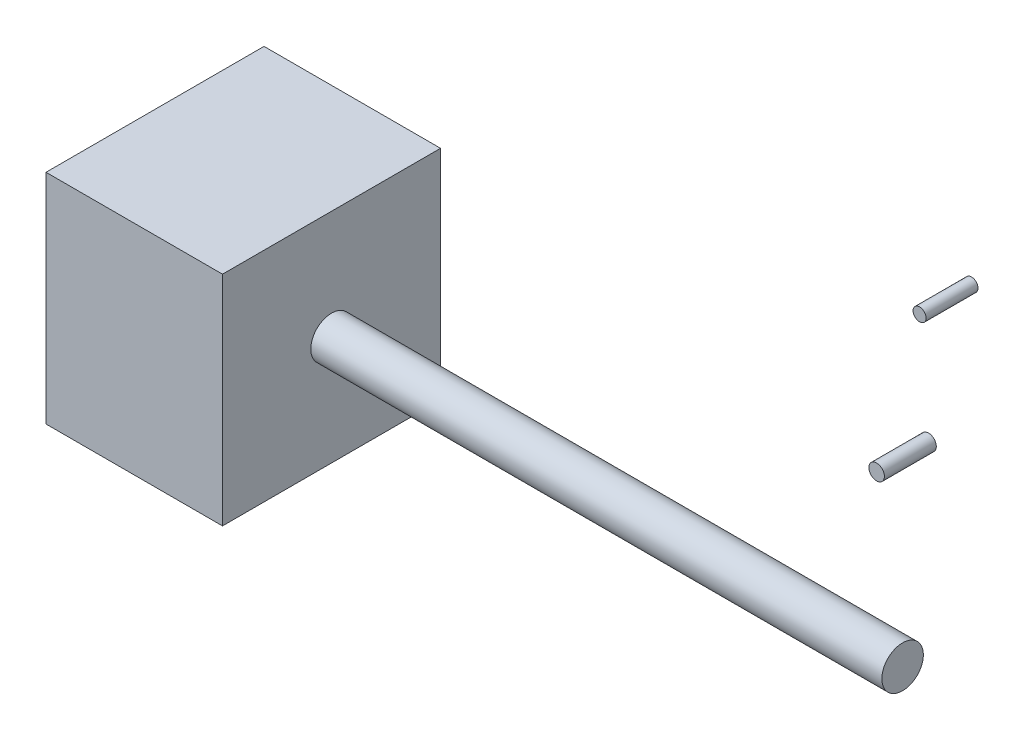
ISO-10303-21;
HEADER;
FILE_DESCRIPTION(('STEP AP214'),'2;1');
FILE_NAME('part.step','',(''),(''),'','','');
FILE_SCHEMA(('AUTOMOTIVE_DESIGN { 1 0 10303 214 1 1 1 1 }'));
ENDSEC;
DATA;
#1=APPLICATION_CONTEXT('core data for automotive mechanical design processes');
#2=APPLICATION_PROTOCOL_DEFINITION('international standard','automotive_design',2000,#1);
#3=PRODUCT_CONTEXT('',#1,'mechanical');
#4=PRODUCT('Part','Part','',(#3));
#5=PRODUCT_RELATED_PRODUCT_CATEGORY('part','',(#4));
#6=PRODUCT_DEFINITION_FORMATION('','',#4);
#7=PRODUCT_DEFINITION_CONTEXT('part definition',#1,'design');
#8=PRODUCT_DEFINITION('design','',#6,#7);
#9=PRODUCT_DEFINITION_SHAPE('','',#8);
#10=(LENGTH_UNIT() NAMED_UNIT(*) SI_UNIT(.MILLI.,.METRE.));
#11=(NAMED_UNIT(*) PLANE_ANGLE_UNIT() SI_UNIT($,.RADIAN.));
#12=(NAMED_UNIT(*) SI_UNIT($,.STERADIAN.) SOLID_ANGLE_UNIT());
#13=UNCERTAINTY_MEASURE_WITH_UNIT(LENGTH_MEASURE(1.E-05),#10,'distance_accuracy_value','');
#14=(GEOMETRIC_REPRESENTATION_CONTEXT(3) GLOBAL_UNCERTAINTY_ASSIGNED_CONTEXT((#13)) GLOBAL_UNIT_ASSIGNED_CONTEXT((#10,
#11,#12)) REPRESENTATION_CONTEXT('',''));
#15=CARTESIAN_POINT('',(0.,0.,0.));
#16=DIRECTION('',(0.,0.,1.));
#17=DIRECTION('',(1.,0.,0.));
#18=AXIS2_PLACEMENT_3D('',#15,#16,#17);
#19=CARTESIAN_POINT('',(108.277164679753,65.4293406084366,5.));
#20=DIRECTION('',(0.,0.,-1.));
#21=DIRECTION('',(-1.,0.,0.));
#22=AXIS2_PLACEMENT_3D('',#19,#20,#21);
#23=CYLINDRICAL_SURFACE('',#22,1.25);
#24=CARTESIAN_POINT('',(108.277164679753,65.4293406084366,5.));
#25=DIRECTION('',(0.,0.,1.));
#26=DIRECTION('',(1.,0.,0.));
#27=AXIS2_PLACEMENT_3D('',#24,#25,#26);
#28=CIRCLE('',#27,1.25);
#29=CARTESIAN_POINT('',(109.527164679753,65.4293406084366,5.));
#30=VERTEX_POINT('',#29);
#31=EDGE_CURVE('E11',#30,#30,#28,.T.);
#32=ORIENTED_EDGE('',*,*,#31,.F.);
#33=EDGE_LOOP('',(#32));
#34=FACE_BOUND('',#33,.T.);
#35=CARTESIAN_POINT('',(108.277164679753,65.4293406084366,-5.));
#36=DIRECTION('',(0.,0.,1.));
#37=DIRECTION('',(1.,0.,0.));
#38=AXIS2_PLACEMENT_3D('',#35,#36,#37);
#39=CIRCLE('',#38,1.25);
#40=CARTESIAN_POINT('',(109.527164679753,65.4293406084366,-5.));
#41=VERTEX_POINT('',#40);
#42=EDGE_CURVE('E44',#41,#41,#39,.T.);
#43=ORIENTED_EDGE('',*,*,#42,.T.);
#44=EDGE_LOOP('',(#43));
#45=FACE_BOUND('',#44,.T.);
#46=ADVANCED_FACE('F41',(#34,#45),#23,.T.);
#47=CARTESIAN_POINT('',(108.277164679753,65.4293406084366,5.));
#48=DIRECTION('',(0.,0.,1.));
#49=DIRECTION('',(1.,0.,0.));
#50=AXIS2_PLACEMENT_3D('',#47,#48,#49);
#51=PLANE('',#50);
#52=ORIENTED_EDGE('',*,*,#31,.T.);
#53=EDGE_LOOP('',(#52));
#54=FACE_BOUND('',#53,.T.);
#55=ADVANCED_FACE('F56',(#54),#51,.T.);
#56=CARTESIAN_POINT('',(108.277164679753,65.4293406084366,-5.));
#57=DIRECTION('',(0.,0.,1.));
#58=DIRECTION('',(1.,0.,0.));
#59=AXIS2_PLACEMENT_3D('',#56,#57,#58);
#60=PLANE('',#59);
#61=ORIENTED_EDGE('',*,*,#42,.F.);
#62=EDGE_LOOP('',(#61));
#63=FACE_BOUND('',#62,.T.);
#64=ADVANCED_FACE('F54',(#63),#60,.F.);
#65=CLOSED_SHELL('',(#46,#55,#64));
#66=MANIFOLD_SOLID_BREP('B2_NOT_SHOWN',#65);
#67=CARTESIAN_POINT('',(100.,35.,5.));
#68=DIRECTION('',(0.,0.,-1.));
#69=DIRECTION('',(-1.,0.,0.));
#70=AXIS2_PLACEMENT_3D('',#67,#68,#69);
#71=CYLINDRICAL_SURFACE('',#70,1.5);
#72=CARTESIAN_POINT('',(100.,35.,5.));
#73=DIRECTION('',(0.,0.,1.));
#74=DIRECTION('',(1.,0.,0.));
#75=AXIS2_PLACEMENT_3D('',#72,#73,#74);
#76=CIRCLE('',#75,1.5);
#77=CARTESIAN_POINT('',(101.5,35.,5.));
#78=VERTEX_POINT('',#77);
#79=EDGE_CURVE('E40',#78,#78,#76,.T.);
#80=ORIENTED_EDGE('',*,*,#79,.F.);
#81=EDGE_LOOP('',(#80));
#82=FACE_BOUND('',#81,.T.);
#83=CARTESIAN_POINT('',(100.,35.,-5.));
#84=DIRECTION('',(0.,0.,1.));
#85=DIRECTION('',(1.,0.,0.));
#86=AXIS2_PLACEMENT_3D('',#83,#84,#85);
#87=CIRCLE('',#86,1.5);
#88=CARTESIAN_POINT('',(101.5,35.,-5.));
#89=VERTEX_POINT('',#88);
#90=EDGE_CURVE('E93',#89,#89,#87,.T.);
#91=ORIENTED_EDGE('',*,*,#90,.T.);
#92=EDGE_LOOP('',(#91));
#93=FACE_BOUND('',#92,.T.);
#94=ADVANCED_FACE('F90',(#82,#93),#71,.T.);
#95=CARTESIAN_POINT('',(100.,35.,5.));
#96=DIRECTION('',(0.,0.,1.));
#97=DIRECTION('',(1.,0.,0.));
#98=AXIS2_PLACEMENT_3D('',#95,#96,#97);
#99=PLANE('',#98);
#100=ORIENTED_EDGE('',*,*,#79,.T.);
#101=EDGE_LOOP('',(#100));
#102=FACE_BOUND('',#101,.T.);
#103=ADVANCED_FACE('F105',(#102),#99,.T.);
#104=CARTESIAN_POINT('',(100.,35.,-5.));
#105=DIRECTION('',(0.,0.,1.));
#106=DIRECTION('',(1.,0.,0.));
#107=AXIS2_PLACEMENT_3D('',#104,#105,#106);
#108=PLANE('',#107);
#109=ORIENTED_EDGE('',*,*,#90,.F.);
#110=EDGE_LOOP('',(#109));
#111=FACE_BOUND('',#110,.T.);
#112=ADVANCED_FACE('F103',(#111),#108,.F.);
#113=CLOSED_SHELL('',(#94,#103,#112));
#114=MANIFOLD_SOLID_BREP('B6_NOT_SHOWN',#113);
#115=CARTESIAN_POINT('',(100.,0.,0.));
#116=DIRECTION('',(-1.,0.,0.));
#117=DIRECTION('',(0.,0.,1.));
#118=AXIS2_PLACEMENT_3D('',#115,#116,#117);
#119=CYLINDRICAL_SURFACE('',#118,4.);
#120=CARTESIAN_POINT('',(100.,0.,0.));
#121=DIRECTION('',(1.,0.,0.));
#122=DIRECTION('',(0.,0.,-1.));
#123=AXIS2_PLACEMENT_3D('',#120,#121,#122);
#124=CIRCLE('',#123,4.);
#125=CARTESIAN_POINT('',(100.,0.,-4.));
#126=VERTEX_POINT('',#125);
#127=EDGE_CURVE('E138',#126,#126,#124,.T.);
#128=ORIENTED_EDGE('',*,*,#127,.F.);
#129=EDGE_LOOP('',(#128));
#130=FACE_BOUND('',#129,.T.);
#131=CARTESIAN_POINT('',(-9.99999999999999,0.,0.));
#132=DIRECTION('',(-1.,0.,0.));
#133=DIRECTION('',(0.,0.,1.));
#134=AXIS2_PLACEMENT_3D('',#131,#132,#133);
#135=CIRCLE('',#134,4.);
#136=CARTESIAN_POINT('',(-9.99999999999999,0.,4.));
#137=VERTEX_POINT('',#136);
#138=EDGE_CURVE('E88',#137,#137,#135,.T.);
#139=ORIENTED_EDGE('',*,*,#138,.F.);
#140=EDGE_LOOP('',(#139));
#141=FACE_BOUND('',#140,.T.);
#142=ADVANCED_FACE('F130',(#130,#141),#119,.T.);
#143=CARTESIAN_POINT('',(100.,0.,0.));
#144=DIRECTION('',(1.,0.,0.));
#145=DIRECTION('',(0.,0.,-1.));
#146=AXIS2_PLACEMENT_3D('',#143,#144,#145);
#147=PLANE('',#146);
#148=ORIENTED_EDGE('',*,*,#127,.T.);
#149=EDGE_LOOP('',(#148));
#150=FACE_BOUND('',#149,.T.);
#151=ADVANCED_FACE('F206',(#150),#147,.T.);
#152=CARTESIAN_POINT('',(-44.,-21.,-21.));
#153=DIRECTION('',(0.,0.,-1.));
#154=DIRECTION('',(-1.,0.,0.));
#155=AXIS2_PLACEMENT_3D('',#152,#153,#154);
#156=PLANE('',#155);
#157=DIRECTION('',(0.,1.,0.));
#158=VECTOR('',#157,1.);
#159=CARTESIAN_POINT('',(-10.,-21.,-21.));
#160=LINE('',#159,#158);
#161=CARTESIAN_POINT('',(-10.,-21.,-21.));
#162=VERTEX_POINT('',#161);
#163=CARTESIAN_POINT('',(-10.,21.,-21.));
#164=VERTEX_POINT('',#163);
#165=EDGE_CURVE('E163',#162,#164,#160,.T.);
#166=ORIENTED_EDGE('',*,*,#165,.F.);
#167=DIRECTION('',(1.,0.,0.));
#168=VECTOR('',#167,1.);
#169=CARTESIAN_POINT('',(-44.,-21.,-21.));
#170=LINE('',#169,#168);
#171=CARTESIAN_POINT('',(-44.,-21.,-21.));
#172=VERTEX_POINT('',#171);
#173=EDGE_CURVE('E193',#172,#162,#170,.T.);
#174=ORIENTED_EDGE('',*,*,#173,.F.);
#175=DIRECTION('',(0.,1.,0.));
#176=VECTOR('',#175,1.);
#177=CARTESIAN_POINT('',(-44.,-21.,-21.));
#178=LINE('',#177,#176);
#179=CARTESIAN_POINT('',(-44.,21.,-21.));
#180=VERTEX_POINT('',#179);
#181=EDGE_CURVE('E200',#172,#180,#178,.T.);
#182=ORIENTED_EDGE('',*,*,#181,.T.);
#183=DIRECTION('',(1.,0.,0.));
#184=VECTOR('',#183,1.);
#185=CARTESIAN_POINT('',(-44.,21.,-21.));
#186=LINE('',#185,#184);
#187=EDGE_CURVE('E190',#180,#164,#186,.T.);
#188=ORIENTED_EDGE('',*,*,#187,.T.);
#189=EDGE_LOOP('',(#166,#174,#182,#188));
#190=FACE_BOUND('',#189,.T.);
#191=ADVANCED_FACE('F222',(#190),#156,.T.);
#192=CARTESIAN_POINT('',(-44.,-21.,21.));
#193=DIRECTION('',(0.,-1.,0.));
#194=DIRECTION('',(0.,0.,-1.));
#195=AXIS2_PLACEMENT_3D('',#192,#193,#194);
#196=PLANE('',#195);
#197=DIRECTION('',(0.,0.,-1.));
#198=VECTOR('',#197,1.);
#199=CARTESIAN_POINT('',(-10.,-21.,21.));
#200=LINE('',#199,#198);
#201=CARTESIAN_POINT('',(-10.,-21.,21.));
#202=VERTEX_POINT('',#201);
#203=EDGE_CURVE('E146',#202,#162,#200,.T.);
#204=ORIENTED_EDGE('',*,*,#203,.F.);
#205=DIRECTION('',(1.,0.,0.));
#206=VECTOR('',#205,1.);
#207=CARTESIAN_POINT('',(-44.,-21.,21.));
#208=LINE('',#207,#206);
#209=CARTESIAN_POINT('',(-44.,-21.,21.));
#210=VERTEX_POINT('',#209);
#211=EDGE_CURVE('E179',#210,#202,#208,.T.);
#212=ORIENTED_EDGE('',*,*,#211,.F.);
#213=DIRECTION('',(0.,0.,-1.));
#214=VECTOR('',#213,1.);
#215=CARTESIAN_POINT('',(-44.,-21.,21.));
#216=LINE('',#215,#214);
#217=EDGE_CURVE('E196',#210,#172,#216,.T.);
#218=ORIENTED_EDGE('',*,*,#217,.T.);
#219=ORIENTED_EDGE('',*,*,#173,.T.);
#220=EDGE_LOOP('',(#204,#212,#218,#219));
#221=FACE_BOUND('',#220,.T.);
#222=ADVANCED_FACE('F226',(#221),#196,.T.);
#223=CARTESIAN_POINT('',(-44.,-21.,21.));
#224=DIRECTION('',(0.,0.,1.));
#225=DIRECTION('',(1.,0.,0.));
#226=AXIS2_PLACEMENT_3D('',#223,#224,#225);
#227=PLANE('',#226);
#228=DIRECTION('',(0.,-1.,0.));
#229=VECTOR('',#228,1.);
#230=CARTESIAN_POINT('',(-10.,-21.,21.));
#231=LINE('',#230,#229);
#232=CARTESIAN_POINT('',(-10.,21.,21.));
#233=VERTEX_POINT('',#232);
#234=EDGE_CURVE('E168',#233,#202,#231,.T.);
#235=ORIENTED_EDGE('',*,*,#234,.F.);
#236=DIRECTION('',(1.,0.,0.));
#237=VECTOR('',#236,1.);
#238=CARTESIAN_POINT('',(-44.,21.,21.));
#239=LINE('',#238,#237);
#240=CARTESIAN_POINT('',(-44.,21.,21.));
#241=VERTEX_POINT('',#240);
#242=EDGE_CURVE('E177',#241,#233,#239,.T.);
#243=ORIENTED_EDGE('',*,*,#242,.F.);
#244=DIRECTION('',(0.,-1.,0.));
#245=VECTOR('',#244,1.);
#246=CARTESIAN_POINT('',(-44.,-21.,21.));
#247=LINE('',#246,#245);
#248=EDGE_CURVE('E192',#241,#210,#247,.T.);
#249=ORIENTED_EDGE('',*,*,#248,.T.);
#250=ORIENTED_EDGE('',*,*,#211,.T.);
#251=EDGE_LOOP('',(#235,#243,#249,#250));
#252=FACE_BOUND('',#251,.T.);
#253=ADVANCED_FACE('F175',(#252),#227,.T.);
#254=CARTESIAN_POINT('',(-44.,21.,21.));
#255=DIRECTION('',(0.,1.,0.));
#256=DIRECTION('',(0.,0.,1.));
#257=AXIS2_PLACEMENT_3D('',#254,#255,#256);
#258=PLANE('',#257);
#259=DIRECTION('',(0.,0.,1.));
#260=VECTOR('',#259,1.);
#261=CARTESIAN_POINT('',(-10.,21.,21.));
#262=LINE('',#261,#260);
#263=EDGE_CURVE('E165',#164,#233,#262,.T.);
#264=ORIENTED_EDGE('',*,*,#263,.F.);
#265=ORIENTED_EDGE('',*,*,#187,.F.);
#266=DIRECTION('',(0.,0.,1.));
#267=VECTOR('',#266,1.);
#268=CARTESIAN_POINT('',(-44.,21.,21.));
#269=LINE('',#268,#267);
#270=EDGE_CURVE('E184',#180,#241,#269,.T.);
#271=ORIENTED_EDGE('',*,*,#270,.T.);
#272=ORIENTED_EDGE('',*,*,#242,.T.);
#273=EDGE_LOOP('',(#264,#265,#271,#272));
#274=FACE_BOUND('',#273,.T.);
#275=ADVANCED_FACE('F182',(#274),#258,.T.);
#276=CARTESIAN_POINT('',(-44.,0.,0.));
#277=DIRECTION('',(-1.,0.,0.));
#278=DIRECTION('',(0.,0.,1.));
#279=AXIS2_PLACEMENT_3D('',#276,#277,#278);
#280=PLANE('',#279);
#281=ORIENTED_EDGE('',*,*,#181,.F.);
#282=ORIENTED_EDGE('',*,*,#217,.F.);
#283=ORIENTED_EDGE('',*,*,#248,.F.);
#284=ORIENTED_EDGE('',*,*,#270,.F.);
#285=EDGE_LOOP('',(#281,#282,#283,#284));
#286=FACE_BOUND('',#285,.T.);
#287=ADVANCED_FACE('F213',(#286),#280,.T.);
#288=CARTESIAN_POINT('',(-10.,0.,0.));
#289=DIRECTION('',(-1.,0.,0.));
#290=DIRECTION('',(0.,0.,1.));
#291=AXIS2_PLACEMENT_3D('',#288,#289,#290);
#292=PLANE('',#291);
#293=ORIENTED_EDGE('',*,*,#138,.T.);
#294=EDGE_LOOP('',(#293));
#295=FACE_BOUND('',#294,.T.);
#296=ORIENTED_EDGE('',*,*,#165,.T.);
#297=ORIENTED_EDGE('',*,*,#263,.T.);
#298=ORIENTED_EDGE('',*,*,#234,.T.);
#299=ORIENTED_EDGE('',*,*,#203,.T.);
#300=EDGE_LOOP('',(#296,#297,#298,#299));
#301=FACE_BOUND('',#300,.T.);
#302=ADVANCED_FACE('F167',(#295,#301),#292,.F.);
#303=CLOSED_SHELL('',(#142,#151,#191,#222,#253,#275,#287,#302));
#304=MANIFOLD_SOLID_BREP('B35',#303);
#305=ADVANCED_BREP_SHAPE_REPRESENTATION('',(#18,#66,#114,#304),#14);
#306=SHAPE_DEFINITION_REPRESENTATION(#9,#305);
ENDSEC;
END-ISO-10303-21;
